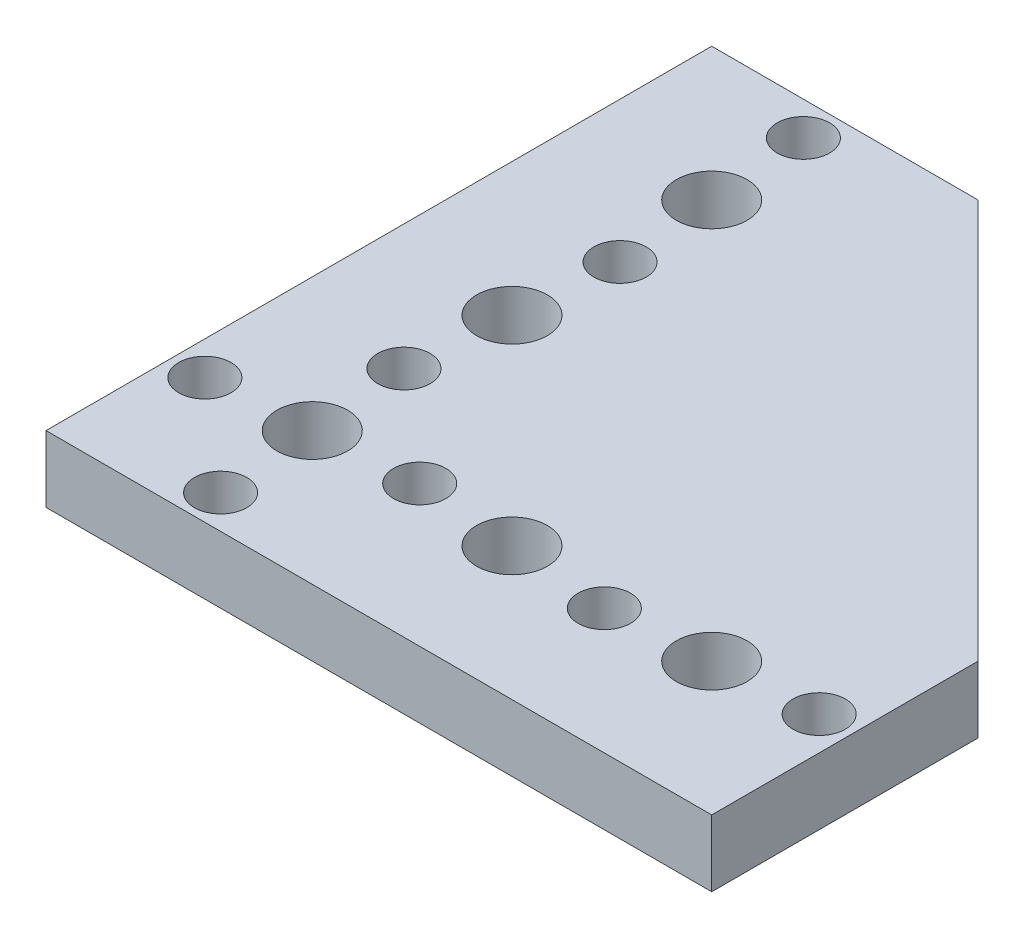
ISO-10303-21;
HEADER;
FILE_DESCRIPTION(('STEP AP214'),'2;1');
FILE_NAME('part.step','',(''),(''),'','','');
FILE_SCHEMA(('AUTOMOTIVE_DESIGN { 1 0 10303 214 1 1 1 1 }'));
ENDSEC;
DATA;
#1=APPLICATION_CONTEXT('core data for automotive mechanical design processes');
#2=APPLICATION_PROTOCOL_DEFINITION('international standard','automotive_design',2000,#1);
#3=PRODUCT_CONTEXT('',#1,'mechanical');
#4=PRODUCT('Part','Part','',(#3));
#5=PRODUCT_RELATED_PRODUCT_CATEGORY('part','',(#4));
#6=PRODUCT_DEFINITION_FORMATION('','',#4);
#7=PRODUCT_DEFINITION_CONTEXT('part definition',#1,'design');
#8=PRODUCT_DEFINITION('design','',#6,#7);
#9=PRODUCT_DEFINITION_SHAPE('','',#8);
#10=(LENGTH_UNIT() NAMED_UNIT(*) SI_UNIT(.MILLI.,.METRE.));
#11=(NAMED_UNIT(*) PLANE_ANGLE_UNIT() SI_UNIT($,.RADIAN.));
#12=(NAMED_UNIT(*) SI_UNIT($,.STERADIAN.) SOLID_ANGLE_UNIT());
#13=UNCERTAINTY_MEASURE_WITH_UNIT(LENGTH_MEASURE(1.E-05),#10,'distance_accuracy_value','');
#14=(GEOMETRIC_REPRESENTATION_CONTEXT(3) GLOBAL_UNCERTAINTY_ASSIGNED_CONTEXT((#13)) GLOBAL_UNIT_ASSIGNED_CONTEXT((#10,
#11,#12)) REPRESENTATION_CONTEXT('',''));
#15=CARTESIAN_POINT('',(0.,0.,0.));
#16=DIRECTION('',(0.,0.,1.));
#17=DIRECTION('',(1.,0.,0.));
#18=AXIS2_PLACEMENT_3D('',#15,#16,#17);
#19=CARTESIAN_POINT('',(63.5,0.,-25.4));
#20=DIRECTION('',(0.707106781186548,0.,-0.707106781186548));
#21=DIRECTION('',(-0.707106781186548,0.,-0.707106781186548));
#22=AXIS2_PLACEMENT_3D('',#19,#20,#21);
#23=PLANE('',#22);
#24=DIRECTION('',(-0.707106781186547,0.,-0.707106781186547));
#25=VECTOR('',#24,1.);
#26=CARTESIAN_POINT('',(63.5,6.35,-25.4));
#27=LINE('',#26,#25);
#28=CARTESIAN_POINT('',(63.5,6.35,-25.4));
#29=VERTEX_POINT('',#28);
#30=CARTESIAN_POINT('',(25.4,6.35,-63.5));
#31=VERTEX_POINT('',#30);
#32=EDGE_CURVE('E114',#29,#31,#27,.T.);
#33=ORIENTED_EDGE('',*,*,#32,.F.);
#34=DIRECTION('',(0.,1.,0.));
#35=VECTOR('',#34,1.);
#36=CARTESIAN_POINT('',(63.5,0.,-25.4));
#37=LINE('',#36,#35);
#38=CARTESIAN_POINT('',(63.5,0.,-25.4));
#39=VERTEX_POINT('',#38);
#40=EDGE_CURVE('E11',#39,#29,#37,.T.);
#41=ORIENTED_EDGE('',*,*,#40,.F.);
#42=DIRECTION('',(-0.707106781186547,0.,-0.707106781186547));
#43=VECTOR('',#42,1.);
#44=CARTESIAN_POINT('',(63.5,0.,-25.4));
#45=LINE('',#44,#43);
#46=CARTESIAN_POINT('',(25.4,0.,-63.5));
#47=VERTEX_POINT('',#46);
#48=EDGE_CURVE('E109',#39,#47,#45,.T.);
#49=ORIENTED_EDGE('',*,*,#48,.T.);
#50=DIRECTION('',(0.,1.,0.));
#51=VECTOR('',#50,1.);
#52=CARTESIAN_POINT('',(25.4,0.,-63.5));
#53=LINE('',#52,#51);
#54=EDGE_CURVE('E40',#47,#31,#53,.T.);
#55=ORIENTED_EDGE('',*,*,#54,.T.);
#56=EDGE_LOOP('',(#33,#41,#49,#55));
#57=FACE_BOUND('',#56,.T.);
#58=ADVANCED_FACE('F37',(#57),#23,.T.);
#59=CARTESIAN_POINT('',(63.5,0.,0.));
#60=DIRECTION('',(1.,0.,0.));
#61=DIRECTION('',(0.,0.,-1.));
#62=AXIS2_PLACEMENT_3D('',#59,#60,#61);
#63=PLANE('',#62);
#64=DIRECTION('',(0.,0.,-1.));
#65=VECTOR('',#64,1.);
#66=CARTESIAN_POINT('',(63.5,6.35,0.));
#67=LINE('',#66,#65);
#68=CARTESIAN_POINT('',(63.5,6.35,0.));
#69=VERTEX_POINT('',#68);
#70=EDGE_CURVE('E124',#69,#29,#67,.T.);
#71=ORIENTED_EDGE('',*,*,#70,.F.);
#72=DIRECTION('',(0.,1.,0.));
#73=VECTOR('',#72,1.);
#74=CARTESIAN_POINT('',(63.5,0.,0.));
#75=LINE('',#74,#73);
#76=CARTESIAN_POINT('',(63.5,0.,0.));
#77=VERTEX_POINT('',#76);
#78=EDGE_CURVE('E46',#77,#69,#75,.T.);
#79=ORIENTED_EDGE('',*,*,#78,.F.);
#80=DIRECTION('',(0.,0.,-1.));
#81=VECTOR('',#80,1.);
#82=CARTESIAN_POINT('',(63.5,0.,0.));
#83=LINE('',#82,#81);
#84=EDGE_CURVE('E104',#77,#39,#83,.T.);
#85=ORIENTED_EDGE('',*,*,#84,.T.);
#86=ORIENTED_EDGE('',*,*,#40,.T.);
#87=EDGE_LOOP('',(#71,#79,#85,#86));
#88=FACE_BOUND('',#87,.T.);
#89=ADVANCED_FACE('F130',(#88),#63,.T.);
#90=CARTESIAN_POINT('',(0.,0.,0.));
#91=DIRECTION('',(0.,0.,1.));
#92=DIRECTION('',(1.,0.,0.));
#93=AXIS2_PLACEMENT_3D('',#90,#91,#92);
#94=PLANE('',#93);
#95=DIRECTION('',(1.,0.,0.));
#96=VECTOR('',#95,1.);
#97=CARTESIAN_POINT('',(0.,6.35,0.));
#98=LINE('',#97,#96);
#99=CARTESIAN_POINT('',(0.,6.35,0.));
#100=VERTEX_POINT('',#99);
#101=EDGE_CURVE('E93',#100,#69,#98,.T.);
#102=ORIENTED_EDGE('',*,*,#101,.F.);
#103=DIRECTION('',(0.,1.,0.));
#104=VECTOR('',#103,1.);
#105=CARTESIAN_POINT('',(0.,0.,0.));
#106=LINE('',#105,#104);
#107=CARTESIAN_POINT('',(0.,0.,0.));
#108=VERTEX_POINT('',#107);
#109=EDGE_CURVE('E88',#108,#100,#106,.T.);
#110=ORIENTED_EDGE('',*,*,#109,.F.);
#111=DIRECTION('',(1.,0.,0.));
#112=VECTOR('',#111,1.);
#113=CARTESIAN_POINT('',(0.,0.,0.));
#114=LINE('',#113,#112);
#115=EDGE_CURVE('E91',#108,#77,#114,.T.);
#116=ORIENTED_EDGE('',*,*,#115,.T.);
#117=ORIENTED_EDGE('',*,*,#78,.T.);
#118=EDGE_LOOP('',(#102,#110,#116,#117));
#119=FACE_BOUND('',#118,.T.);
#120=ADVANCED_FACE('F90',(#119),#94,.T.);
#121=CARTESIAN_POINT('',(0.,0.,-63.5));
#122=DIRECTION('',(-1.,0.,0.));
#123=DIRECTION('',(0.,0.,1.));
#124=AXIS2_PLACEMENT_3D('',#121,#122,#123);
#125=PLANE('',#124);
#126=DIRECTION('',(0.,0.,1.));
#127=VECTOR('',#126,1.);
#128=CARTESIAN_POINT('',(0.,6.35,-63.5));
#129=LINE('',#128,#127);
#130=CARTESIAN_POINT('',(0.,6.35,-63.5));
#131=VERTEX_POINT('',#130);
#132=EDGE_CURVE('E121',#131,#100,#129,.T.);
#133=ORIENTED_EDGE('',*,*,#132,.F.);
#134=DIRECTION('',(0.,1.,0.));
#135=VECTOR('',#134,1.);
#136=CARTESIAN_POINT('',(0.,0.,-63.5));
#137=LINE('',#136,#135);
#138=CARTESIAN_POINT('',(0.,0.,-63.5));
#139=VERTEX_POINT('',#138);
#140=EDGE_CURVE('E98',#139,#131,#137,.T.);
#141=ORIENTED_EDGE('',*,*,#140,.F.);
#142=DIRECTION('',(0.,0.,1.));
#143=VECTOR('',#142,1.);
#144=CARTESIAN_POINT('',(0.,0.,-63.5));
#145=LINE('',#144,#143);
#146=EDGE_CURVE('E103',#139,#108,#145,.T.);
#147=ORIENTED_EDGE('',*,*,#146,.T.);
#148=ORIENTED_EDGE('',*,*,#109,.T.);
#149=EDGE_LOOP('',(#133,#141,#147,#148));
#150=FACE_BOUND('',#149,.T.);
#151=ADVANCED_FACE('F106',(#150),#125,.T.);
#152=CARTESIAN_POINT('',(25.4,0.,-63.5));
#153=DIRECTION('',(0.,0.,-1.));
#154=DIRECTION('',(-1.,0.,0.));
#155=AXIS2_PLACEMENT_3D('',#152,#153,#154);
#156=PLANE('',#155);
#157=DIRECTION('',(-1.,0.,0.));
#158=VECTOR('',#157,1.);
#159=CARTESIAN_POINT('',(25.4,6.35,-63.5));
#160=LINE('',#159,#158);
#161=EDGE_CURVE('E117',#31,#131,#160,.T.);
#162=ORIENTED_EDGE('',*,*,#161,.F.);
#163=ORIENTED_EDGE('',*,*,#54,.F.);
#164=DIRECTION('',(-1.,0.,0.));
#165=VECTOR('',#164,1.);
#166=CARTESIAN_POINT('',(25.4,0.,-63.5));
#167=LINE('',#166,#165);
#168=EDGE_CURVE('E107',#47,#139,#167,.T.);
#169=ORIENTED_EDGE('',*,*,#168,.T.);
#170=ORIENTED_EDGE('',*,*,#140,.T.);
#171=EDGE_LOOP('',(#162,#163,#169,#170));
#172=FACE_BOUND('',#171,.T.);
#173=ADVANCED_FACE('F127',(#172),#156,.T.);
#174=CARTESIAN_POINT('',(0.,0.,0.));
#175=DIRECTION('',(0.,1.,0.));
#176=DIRECTION('',(0.,0.,1.));
#177=AXIS2_PLACEMENT_3D('',#174,#175,#176);
#178=PLANE('',#177);
#179=CARTESIAN_POINT('',(12.7,0.,-12.7));
#180=DIRECTION('',(0.,1.,0.));
#181=DIRECTION('',(0.,0.,-1.));
#182=AXIS2_PLACEMENT_3D('',#179,#180,#181);
#183=CIRCLE('',#182,3.375);
#184=CARTESIAN_POINT('',(12.7,0.,-16.075));
#185=VERTEX_POINT('',#184);
#186=EDGE_CURVE('E209',#185,#185,#183,.T.);
#187=ORIENTED_EDGE('',*,*,#186,.T.);
#188=EDGE_LOOP('',(#187));
#189=FACE_BOUND('',#188,.T.);
#190=CARTESIAN_POINT('',(31.75,0.,-12.7));
#191=DIRECTION('',(0.,1.,0.));
#192=DIRECTION('',(0.,0.,-1.));
#193=AXIS2_PLACEMENT_3D('',#190,#191,#192);
#194=CIRCLE('',#193,3.375);
#195=CARTESIAN_POINT('',(31.75,0.,-16.075));
#196=VERTEX_POINT('',#195);
#197=EDGE_CURVE('E217',#196,#196,#194,.T.);
#198=ORIENTED_EDGE('',*,*,#197,.T.);
#199=EDGE_LOOP('',(#198));
#200=FACE_BOUND('',#199,.T.);
#201=CARTESIAN_POINT('',(50.8,0.,-12.7));
#202=DIRECTION('',(0.,1.,0.));
#203=DIRECTION('',(0.,0.,-1.));
#204=AXIS2_PLACEMENT_3D('',#201,#202,#203);
#205=CIRCLE('',#204,3.375);
#206=CARTESIAN_POINT('',(50.8,0.,-16.075));
#207=VERTEX_POINT('',#206);
#208=EDGE_CURVE('E223',#207,#207,#205,.T.);
#209=ORIENTED_EDGE('',*,*,#208,.T.);
#210=EDGE_LOOP('',(#209));
#211=FACE_BOUND('',#210,.T.);
#212=CARTESIAN_POINT('',(12.7,0.,-31.75));
#213=DIRECTION('',(0.,1.,0.));
#214=DIRECTION('',(0.,0.,-1.));
#215=AXIS2_PLACEMENT_3D('',#212,#213,#214);
#216=CIRCLE('',#215,3.375);
#217=CARTESIAN_POINT('',(12.7,0.,-35.125));
#218=VERTEX_POINT('',#217);
#219=EDGE_CURVE('E229',#218,#218,#216,.T.);
#220=ORIENTED_EDGE('',*,*,#219,.T.);
#221=EDGE_LOOP('',(#220));
#222=FACE_BOUND('',#221,.T.);
#223=CARTESIAN_POINT('',(12.7,0.,-50.8));
#224=DIRECTION('',(0.,1.,0.));
#225=DIRECTION('',(0.,0.,-1.));
#226=AXIS2_PLACEMENT_3D('',#223,#224,#225);
#227=CIRCLE('',#226,3.375);
#228=CARTESIAN_POINT('',(12.7,0.,-54.175));
#229=VERTEX_POINT('',#228);
#230=EDGE_CURVE('E235',#229,#229,#227,.T.);
#231=ORIENTED_EDGE('',*,*,#230,.T.);
#232=EDGE_LOOP('',(#231));
#233=FACE_BOUND('',#232,.T.);
#234=CARTESIAN_POINT('',(60.2953316719323,0.,-13.4512));
#235=DIRECTION('',(0.,1.,0.));
#236=DIRECTION('',(0.,0.,-1.));
#237=AXIS2_PLACEMENT_3D('',#234,#235,#236);
#238=CIRCLE('',#237,2.5);
#239=CARTESIAN_POINT('',(60.2953316719323,0.,-15.9512));
#240=VERTEX_POINT('',#239);
#241=EDGE_CURVE('E241',#240,#240,#238,.T.);
#242=ORIENTED_EDGE('',*,*,#241,.T.);
#243=EDGE_LOOP('',(#242));
#244=FACE_BOUND('',#243,.T.);
#245=CARTESIAN_POINT('',(41.3046683280677,0.,-11.9488));
#246=DIRECTION('',(0.,1.,0.));
#247=DIRECTION('',(0.,0.,-1.));
#248=AXIS2_PLACEMENT_3D('',#245,#246,#247);
#249=CIRCLE('',#248,2.5);
#250=CARTESIAN_POINT('',(41.3046683280677,0.,-14.4488));
#251=VERTEX_POINT('',#250);
#252=EDGE_CURVE('E247',#251,#251,#249,.T.);
#253=ORIENTED_EDGE('',*,*,#252,.T.);
#254=EDGE_LOOP('',(#253));
#255=FACE_BOUND('',#254,.T.);
#256=CARTESIAN_POINT('',(3.20466832806773,0.,-11.9488));
#257=DIRECTION('',(0.,1.,0.));
#258=DIRECTION('',(0.,0.,-1.));
#259=AXIS2_PLACEMENT_3D('',#256,#257,#258);
#260=CIRCLE('',#259,2.5);
#261=CARTESIAN_POINT('',(3.20466832806773,0.,-14.4488));
#262=VERTEX_POINT('',#261);
#263=EDGE_CURVE('E253',#262,#262,#260,.T.);
#264=ORIENTED_EDGE('',*,*,#263,.T.);
#265=EDGE_LOOP('',(#264));
#266=FACE_BOUND('',#265,.T.);
#267=CARTESIAN_POINT('',(22.1953316719323,0.,-13.4512));
#268=DIRECTION('',(0.,1.,0.));
#269=DIRECTION('',(0.,0.,-1.));
#270=AXIS2_PLACEMENT_3D('',#267,#268,#269);
#271=CIRCLE('',#270,2.5);
#272=CARTESIAN_POINT('',(22.1953316719323,0.,-15.9512));
#273=VERTEX_POINT('',#272);
#274=EDGE_CURVE('E259',#273,#273,#271,.T.);
#275=ORIENTED_EDGE('',*,*,#274,.T.);
#276=EDGE_LOOP('',(#275));
#277=FACE_BOUND('',#276,.T.);
#278=CARTESIAN_POINT('',(13.4512,0.,-3.20466832806772));
#279=DIRECTION('',(0.,1.,0.));
#280=DIRECTION('',(0.,0.,-1.));
#281=AXIS2_PLACEMENT_3D('',#278,#279,#280);
#282=CIRCLE('',#281,2.5);
#283=CARTESIAN_POINT('',(13.4512,0.,-5.70466832806772));
#284=VERTEX_POINT('',#283);
#285=EDGE_CURVE('E265',#284,#284,#282,.T.);
#286=ORIENTED_EDGE('',*,*,#285,.T.);
#287=EDGE_LOOP('',(#286));
#288=FACE_BOUND('',#287,.T.);
#289=CARTESIAN_POINT('',(11.9488,0.,-22.1953316719323));
#290=DIRECTION('',(0.,1.,0.));
#291=DIRECTION('',(0.,0.,-1.));
#292=AXIS2_PLACEMENT_3D('',#289,#290,#291);
#293=CIRCLE('',#292,2.5);
#294=CARTESIAN_POINT('',(11.9488,0.,-24.6953316719323));
#295=VERTEX_POINT('',#294);
#296=EDGE_CURVE('E271',#295,#295,#293,.T.);
#297=ORIENTED_EDGE('',*,*,#296,.T.);
#298=EDGE_LOOP('',(#297));
#299=FACE_BOUND('',#298,.T.);
#300=CARTESIAN_POINT('',(11.9488,0.,-60.2953316719323));
#301=DIRECTION('',(0.,1.,0.));
#302=DIRECTION('',(0.,0.,-1.));
#303=AXIS2_PLACEMENT_3D('',#300,#301,#302);
#304=CIRCLE('',#303,2.5);
#305=CARTESIAN_POINT('',(11.9488,0.,-62.7953316719323));
#306=VERTEX_POINT('',#305);
#307=EDGE_CURVE('E277',#306,#306,#304,.T.);
#308=ORIENTED_EDGE('',*,*,#307,.T.);
#309=EDGE_LOOP('',(#308));
#310=FACE_BOUND('',#309,.T.);
#311=CARTESIAN_POINT('',(13.4512,0.,-41.3046683280677));
#312=DIRECTION('',(0.,1.,0.));
#313=DIRECTION('',(0.,0.,-1.));
#314=AXIS2_PLACEMENT_3D('',#311,#312,#313);
#315=CIRCLE('',#314,2.5);
#316=CARTESIAN_POINT('',(13.4512,0.,-43.8046683280677));
#317=VERTEX_POINT('',#316);
#318=EDGE_CURVE('E118',#317,#317,#315,.T.);
#319=ORIENTED_EDGE('',*,*,#318,.T.);
#320=EDGE_LOOP('',(#319));
#321=FACE_BOUND('',#320,.T.);
#322=ORIENTED_EDGE('',*,*,#48,.F.);
#323=ORIENTED_EDGE('',*,*,#84,.F.);
#324=ORIENTED_EDGE('',*,*,#115,.F.);
#325=ORIENTED_EDGE('',*,*,#146,.F.);
#326=ORIENTED_EDGE('',*,*,#168,.F.);
#327=EDGE_LOOP('',(#322,#323,#324,#325,#326));
#328=FACE_BOUND('',#327,.T.);
#329=ADVANCED_FACE('F102',(#189,#200,#211,#222,#233,#244,#255,#266,#277,#288,#299,#310,#321,
#328),#178,.F.);
#330=CARTESIAN_POINT('',(0.,6.35,0.));
#331=DIRECTION('',(0.,1.,0.));
#332=DIRECTION('',(0.,0.,1.));
#333=AXIS2_PLACEMENT_3D('',#330,#331,#332);
#334=PLANE('',#333);
#335=CARTESIAN_POINT('',(12.7,6.35,-12.7));
#336=DIRECTION('',(0.,1.,0.));
#337=DIRECTION('',(0.,0.,-1.));
#338=AXIS2_PLACEMENT_3D('',#335,#336,#337);
#339=CIRCLE('',#338,3.375);
#340=CARTESIAN_POINT('',(12.7,6.35,-16.075));
#341=VERTEX_POINT('',#340);
#342=EDGE_CURVE('E212',#341,#341,#339,.T.);
#343=ORIENTED_EDGE('',*,*,#342,.F.);
#344=EDGE_LOOP('',(#343));
#345=FACE_BOUND('',#344,.T.);
#346=CARTESIAN_POINT('',(31.75,6.35,-12.7));
#347=DIRECTION('',(0.,1.,0.));
#348=DIRECTION('',(0.,0.,-1.));
#349=AXIS2_PLACEMENT_3D('',#346,#347,#348);
#350=CIRCLE('',#349,3.375);
#351=CARTESIAN_POINT('',(31.75,6.35,-16.075));
#352=VERTEX_POINT('',#351);
#353=EDGE_CURVE('E214',#352,#352,#350,.T.);
#354=ORIENTED_EDGE('',*,*,#353,.F.);
#355=EDGE_LOOP('',(#354));
#356=FACE_BOUND('',#355,.T.);
#357=CARTESIAN_POINT('',(50.8,6.35,-12.7));
#358=DIRECTION('',(0.,1.,0.));
#359=DIRECTION('',(0.,0.,-1.));
#360=AXIS2_PLACEMENT_3D('',#357,#358,#359);
#361=CIRCLE('',#360,3.375);
#362=CARTESIAN_POINT('',(50.8,6.35,-16.075));
#363=VERTEX_POINT('',#362);
#364=EDGE_CURVE('E220',#363,#363,#361,.T.);
#365=ORIENTED_EDGE('',*,*,#364,.F.);
#366=EDGE_LOOP('',(#365));
#367=FACE_BOUND('',#366,.T.);
#368=CARTESIAN_POINT('',(12.7,6.35,-31.75));
#369=DIRECTION('',(0.,1.,0.));
#370=DIRECTION('',(0.,0.,-1.));
#371=AXIS2_PLACEMENT_3D('',#368,#369,#370);
#372=CIRCLE('',#371,3.375);
#373=CARTESIAN_POINT('',(12.7,6.35,-35.125));
#374=VERTEX_POINT('',#373);
#375=EDGE_CURVE('E226',#374,#374,#372,.T.);
#376=ORIENTED_EDGE('',*,*,#375,.F.);
#377=EDGE_LOOP('',(#376));
#378=FACE_BOUND('',#377,.T.);
#379=CARTESIAN_POINT('',(12.7,6.35,-50.8));
#380=DIRECTION('',(0.,1.,0.));
#381=DIRECTION('',(0.,0.,-1.));
#382=AXIS2_PLACEMENT_3D('',#379,#380,#381);
#383=CIRCLE('',#382,3.375);
#384=CARTESIAN_POINT('',(12.7,6.35,-54.175));
#385=VERTEX_POINT('',#384);
#386=EDGE_CURVE('E232',#385,#385,#383,.T.);
#387=ORIENTED_EDGE('',*,*,#386,.F.);
#388=EDGE_LOOP('',(#387));
#389=FACE_BOUND('',#388,.T.);
#390=CARTESIAN_POINT('',(60.2953316719323,6.35,-13.4512));
#391=DIRECTION('',(0.,1.,0.));
#392=DIRECTION('',(0.,0.,-1.));
#393=AXIS2_PLACEMENT_3D('',#390,#391,#392);
#394=CIRCLE('',#393,2.5);
#395=CARTESIAN_POINT('',(60.2953316719323,6.35,-15.9512));
#396=VERTEX_POINT('',#395);
#397=EDGE_CURVE('E238',#396,#396,#394,.T.);
#398=ORIENTED_EDGE('',*,*,#397,.F.);
#399=EDGE_LOOP('',(#398));
#400=FACE_BOUND('',#399,.T.);
#401=CARTESIAN_POINT('',(41.3046683280677,6.35,-11.9488));
#402=DIRECTION('',(0.,1.,0.));
#403=DIRECTION('',(0.,0.,-1.));
#404=AXIS2_PLACEMENT_3D('',#401,#402,#403);
#405=CIRCLE('',#404,2.5);
#406=CARTESIAN_POINT('',(41.3046683280677,6.35,-14.4488));
#407=VERTEX_POINT('',#406);
#408=EDGE_CURVE('E244',#407,#407,#405,.T.);
#409=ORIENTED_EDGE('',*,*,#408,.F.);
#410=EDGE_LOOP('',(#409));
#411=FACE_BOUND('',#410,.T.);
#412=CARTESIAN_POINT('',(3.20466832806773,6.35,-11.9488));
#413=DIRECTION('',(0.,1.,0.));
#414=DIRECTION('',(0.,0.,-1.));
#415=AXIS2_PLACEMENT_3D('',#412,#413,#414);
#416=CIRCLE('',#415,2.5);
#417=CARTESIAN_POINT('',(3.20466832806773,6.35,-14.4488));
#418=VERTEX_POINT('',#417);
#419=EDGE_CURVE('E250',#418,#418,#416,.T.);
#420=ORIENTED_EDGE('',*,*,#419,.F.);
#421=EDGE_LOOP('',(#420));
#422=FACE_BOUND('',#421,.T.);
#423=CARTESIAN_POINT('',(22.1953316719323,6.35,-13.4512));
#424=DIRECTION('',(0.,1.,0.));
#425=DIRECTION('',(0.,0.,-1.));
#426=AXIS2_PLACEMENT_3D('',#423,#424,#425);
#427=CIRCLE('',#426,2.5);
#428=CARTESIAN_POINT('',(22.1953316719323,6.35,-15.9512));
#429=VERTEX_POINT('',#428);
#430=EDGE_CURVE('E256',#429,#429,#427,.T.);
#431=ORIENTED_EDGE('',*,*,#430,.F.);
#432=EDGE_LOOP('',(#431));
#433=FACE_BOUND('',#432,.T.);
#434=CARTESIAN_POINT('',(13.4512,6.35,-3.20466832806772));
#435=DIRECTION('',(0.,1.,0.));
#436=DIRECTION('',(0.,0.,-1.));
#437=AXIS2_PLACEMENT_3D('',#434,#435,#436);
#438=CIRCLE('',#437,2.5);
#439=CARTESIAN_POINT('',(13.4512,6.35,-5.70466832806772));
#440=VERTEX_POINT('',#439);
#441=EDGE_CURVE('E262',#440,#440,#438,.T.);
#442=ORIENTED_EDGE('',*,*,#441,.F.);
#443=EDGE_LOOP('',(#442));
#444=FACE_BOUND('',#443,.T.);
#445=CARTESIAN_POINT('',(11.9488,6.35,-22.1953316719323));
#446=DIRECTION('',(0.,1.,0.));
#447=DIRECTION('',(0.,0.,-1.));
#448=AXIS2_PLACEMENT_3D('',#445,#446,#447);
#449=CIRCLE('',#448,2.5);
#450=CARTESIAN_POINT('',(11.9488,6.35,-24.6953316719323));
#451=VERTEX_POINT('',#450);
#452=EDGE_CURVE('E268',#451,#451,#449,.T.);
#453=ORIENTED_EDGE('',*,*,#452,.F.);
#454=EDGE_LOOP('',(#453));
#455=FACE_BOUND('',#454,.T.);
#456=CARTESIAN_POINT('',(11.9488,6.35,-60.2953316719323));
#457=DIRECTION('',(0.,1.,0.));
#458=DIRECTION('',(0.,0.,-1.));
#459=AXIS2_PLACEMENT_3D('',#456,#457,#458);
#460=CIRCLE('',#459,2.5);
#461=CARTESIAN_POINT('',(11.9488,6.35,-62.7953316719323));
#462=VERTEX_POINT('',#461);
#463=EDGE_CURVE('E274',#462,#462,#460,.T.);
#464=ORIENTED_EDGE('',*,*,#463,.F.);
#465=EDGE_LOOP('',(#464));
#466=FACE_BOUND('',#465,.T.);
#467=CARTESIAN_POINT('',(13.4512,6.35,-41.3046683280677));
#468=DIRECTION('',(0.,1.,0.));
#469=DIRECTION('',(0.,0.,-1.));
#470=AXIS2_PLACEMENT_3D('',#467,#468,#469);
#471=CIRCLE('',#470,2.5);
#472=CARTESIAN_POINT('',(13.4512,6.35,-43.8046683280677));
#473=VERTEX_POINT('',#472);
#474=EDGE_CURVE('E280',#473,#473,#471,.T.);
#475=ORIENTED_EDGE('',*,*,#474,.F.);
#476=EDGE_LOOP('',(#475));
#477=FACE_BOUND('',#476,.T.);
#478=ORIENTED_EDGE('',*,*,#32,.T.);
#479=ORIENTED_EDGE('',*,*,#161,.T.);
#480=ORIENTED_EDGE('',*,*,#132,.T.);
#481=ORIENTED_EDGE('',*,*,#101,.T.);
#482=ORIENTED_EDGE('',*,*,#70,.T.);
#483=EDGE_LOOP('',(#478,#479,#480,#481,#482));
#484=FACE_BOUND('',#483,.T.);
#485=ADVANCED_FACE('F129',(#345,#356,#367,#378,#389,#400,#411,#422,#433,#444,#455,#466,#477,
#484),#334,.T.);
#486=CARTESIAN_POINT('',(13.4512,0.,-41.3046683280677));
#487=DIRECTION('',(0.,1.,0.));
#488=DIRECTION('',(0.,0.,1.));
#489=AXIS2_PLACEMENT_3D('',#486,#487,#488);
#490=CYLINDRICAL_SURFACE('',#489,2.5);
#491=ORIENTED_EDGE('',*,*,#318,.F.);
#492=EDGE_LOOP('',(#491));
#493=FACE_BOUND('',#492,.T.);
#494=ORIENTED_EDGE('',*,*,#474,.T.);
#495=EDGE_LOOP('',(#494));
#496=FACE_BOUND('',#495,.T.);
#497=ADVANCED_FACE('F150',(#493,#496),#490,.F.);
#498=CARTESIAN_POINT('',(11.9488,0.,-60.2953316719323));
#499=DIRECTION('',(0.,1.,0.));
#500=DIRECTION('',(0.,0.,1.));
#501=AXIS2_PLACEMENT_3D('',#498,#499,#500);
#502=CYLINDRICAL_SURFACE('',#501,2.5);
#503=ORIENTED_EDGE('',*,*,#307,.F.);
#504=EDGE_LOOP('',(#503));
#505=FACE_BOUND('',#504,.T.);
#506=ORIENTED_EDGE('',*,*,#463,.T.);
#507=EDGE_LOOP('',(#506));
#508=FACE_BOUND('',#507,.T.);
#509=ADVANCED_FACE('F157',(#505,#508),#502,.F.);
#510=CARTESIAN_POINT('',(11.9488,0.,-22.1953316719323));
#511=DIRECTION('',(0.,1.,0.));
#512=DIRECTION('',(0.,0.,1.));
#513=AXIS2_PLACEMENT_3D('',#510,#511,#512);
#514=CYLINDRICAL_SURFACE('',#513,2.5);
#515=ORIENTED_EDGE('',*,*,#296,.F.);
#516=EDGE_LOOP('',(#515));
#517=FACE_BOUND('',#516,.T.);
#518=ORIENTED_EDGE('',*,*,#452,.T.);
#519=EDGE_LOOP('',(#518));
#520=FACE_BOUND('',#519,.T.);
#521=ADVANCED_FACE('F161',(#517,#520),#514,.F.);
#522=CARTESIAN_POINT('',(13.4512,0.,-3.20466832806772));
#523=DIRECTION('',(0.,1.,0.));
#524=DIRECTION('',(0.,0.,1.));
#525=AXIS2_PLACEMENT_3D('',#522,#523,#524);
#526=CYLINDRICAL_SURFACE('',#525,2.5);
#527=ORIENTED_EDGE('',*,*,#285,.F.);
#528=EDGE_LOOP('',(#527));
#529=FACE_BOUND('',#528,.T.);
#530=ORIENTED_EDGE('',*,*,#441,.T.);
#531=EDGE_LOOP('',(#530));
#532=FACE_BOUND('',#531,.T.);
#533=ADVANCED_FACE('F165',(#529,#532),#526,.F.);
#534=CARTESIAN_POINT('',(22.1953316719323,0.,-13.4512));
#535=DIRECTION('',(0.,1.,0.));
#536=DIRECTION('',(0.,0.,1.));
#537=AXIS2_PLACEMENT_3D('',#534,#535,#536);
#538=CYLINDRICAL_SURFACE('',#537,2.5);
#539=ORIENTED_EDGE('',*,*,#274,.F.);
#540=EDGE_LOOP('',(#539));
#541=FACE_BOUND('',#540,.T.);
#542=ORIENTED_EDGE('',*,*,#430,.T.);
#543=EDGE_LOOP('',(#542));
#544=FACE_BOUND('',#543,.T.);
#545=ADVANCED_FACE('F169',(#541,#544),#538,.F.);
#546=CARTESIAN_POINT('',(3.20466832806773,0.,-11.9488));
#547=DIRECTION('',(0.,1.,0.));
#548=DIRECTION('',(0.,0.,1.));
#549=AXIS2_PLACEMENT_3D('',#546,#547,#548);
#550=CYLINDRICAL_SURFACE('',#549,2.5);
#551=ORIENTED_EDGE('',*,*,#263,.F.);
#552=EDGE_LOOP('',(#551));
#553=FACE_BOUND('',#552,.T.);
#554=ORIENTED_EDGE('',*,*,#419,.T.);
#555=EDGE_LOOP('',(#554));
#556=FACE_BOUND('',#555,.T.);
#557=ADVANCED_FACE('F173',(#553,#556),#550,.F.);
#558=CARTESIAN_POINT('',(41.3046683280677,0.,-11.9488));
#559=DIRECTION('',(0.,1.,0.));
#560=DIRECTION('',(0.,0.,1.));
#561=AXIS2_PLACEMENT_3D('',#558,#559,#560);
#562=CYLINDRICAL_SURFACE('',#561,2.5);
#563=ORIENTED_EDGE('',*,*,#252,.F.);
#564=EDGE_LOOP('',(#563));
#565=FACE_BOUND('',#564,.T.);
#566=ORIENTED_EDGE('',*,*,#408,.T.);
#567=EDGE_LOOP('',(#566));
#568=FACE_BOUND('',#567,.T.);
#569=ADVANCED_FACE('F177',(#565,#568),#562,.F.);
#570=CARTESIAN_POINT('',(60.2953316719323,0.,-13.4512));
#571=DIRECTION('',(0.,1.,0.));
#572=DIRECTION('',(0.,0.,1.));
#573=AXIS2_PLACEMENT_3D('',#570,#571,#572);
#574=CYLINDRICAL_SURFACE('',#573,2.5);
#575=ORIENTED_EDGE('',*,*,#241,.F.);
#576=EDGE_LOOP('',(#575));
#577=FACE_BOUND('',#576,.T.);
#578=ORIENTED_EDGE('',*,*,#397,.T.);
#579=EDGE_LOOP('',(#578));
#580=FACE_BOUND('',#579,.T.);
#581=ADVANCED_FACE('F181',(#577,#580),#574,.F.);
#582=CARTESIAN_POINT('',(12.7,0.,-50.8));
#583=DIRECTION('',(0.,1.,0.));
#584=DIRECTION('',(0.,0.,1.));
#585=AXIS2_PLACEMENT_3D('',#582,#583,#584);
#586=CYLINDRICAL_SURFACE('',#585,3.375);
#587=ORIENTED_EDGE('',*,*,#230,.F.);
#588=EDGE_LOOP('',(#587));
#589=FACE_BOUND('',#588,.T.);
#590=ORIENTED_EDGE('',*,*,#386,.T.);
#591=EDGE_LOOP('',(#590));
#592=FACE_BOUND('',#591,.T.);
#593=ADVANCED_FACE('F185',(#589,#592),#586,.F.);
#594=CARTESIAN_POINT('',(12.7,0.,-31.75));
#595=DIRECTION('',(0.,1.,0.));
#596=DIRECTION('',(0.,0.,1.));
#597=AXIS2_PLACEMENT_3D('',#594,#595,#596);
#598=CYLINDRICAL_SURFACE('',#597,3.375);
#599=ORIENTED_EDGE('',*,*,#219,.F.);
#600=EDGE_LOOP('',(#599));
#601=FACE_BOUND('',#600,.T.);
#602=ORIENTED_EDGE('',*,*,#375,.T.);
#603=EDGE_LOOP('',(#602));
#604=FACE_BOUND('',#603,.T.);
#605=ADVANCED_FACE('F189',(#601,#604),#598,.F.);
#606=CARTESIAN_POINT('',(50.8,0.,-12.7));
#607=DIRECTION('',(0.,1.,0.));
#608=DIRECTION('',(0.,0.,1.));
#609=AXIS2_PLACEMENT_3D('',#606,#607,#608);
#610=CYLINDRICAL_SURFACE('',#609,3.375);
#611=ORIENTED_EDGE('',*,*,#208,.F.);
#612=EDGE_LOOP('',(#611));
#613=FACE_BOUND('',#612,.T.);
#614=ORIENTED_EDGE('',*,*,#364,.T.);
#615=EDGE_LOOP('',(#614));
#616=FACE_BOUND('',#615,.T.);
#617=ADVANCED_FACE('F193',(#613,#616),#610,.F.);
#618=CARTESIAN_POINT('',(31.75,0.,-12.7));
#619=DIRECTION('',(0.,1.,0.));
#620=DIRECTION('',(0.,0.,1.));
#621=AXIS2_PLACEMENT_3D('',#618,#619,#620);
#622=CYLINDRICAL_SURFACE('',#621,3.375);
#623=ORIENTED_EDGE('',*,*,#197,.F.);
#624=EDGE_LOOP('',(#623));
#625=FACE_BOUND('',#624,.T.);
#626=ORIENTED_EDGE('',*,*,#353,.T.);
#627=EDGE_LOOP('',(#626));
#628=FACE_BOUND('',#627,.T.);
#629=ADVANCED_FACE('F197',(#625,#628),#622,.F.);
#630=CARTESIAN_POINT('',(12.7,0.,-12.7));
#631=DIRECTION('',(0.,1.,0.));
#632=DIRECTION('',(0.,0.,1.));
#633=AXIS2_PLACEMENT_3D('',#630,#631,#632);
#634=CYLINDRICAL_SURFACE('',#633,3.375);
#635=ORIENTED_EDGE('',*,*,#186,.F.);
#636=EDGE_LOOP('',(#635));
#637=FACE_BOUND('',#636,.T.);
#638=ORIENTED_EDGE('',*,*,#342,.T.);
#639=EDGE_LOOP('',(#638));
#640=FACE_BOUND('',#639,.T.);
#641=ADVANCED_FACE('F201',(#637,#640),#634,.F.);
#642=CLOSED_SHELL('',(#58,#89,#120,#151,#173,#329,#485,#497,#509,#521,#533,#545,#557,#569,#581,
#593,#605,#617,#629,#641));
#643=MANIFOLD_SOLID_BREP('B2',#642);
#644=ADVANCED_BREP_SHAPE_REPRESENTATION('',(#18,#643),#14);
#645=SHAPE_DEFINITION_REPRESENTATION(#9,#644);
ENDSEC;
END-ISO-10303-21;
